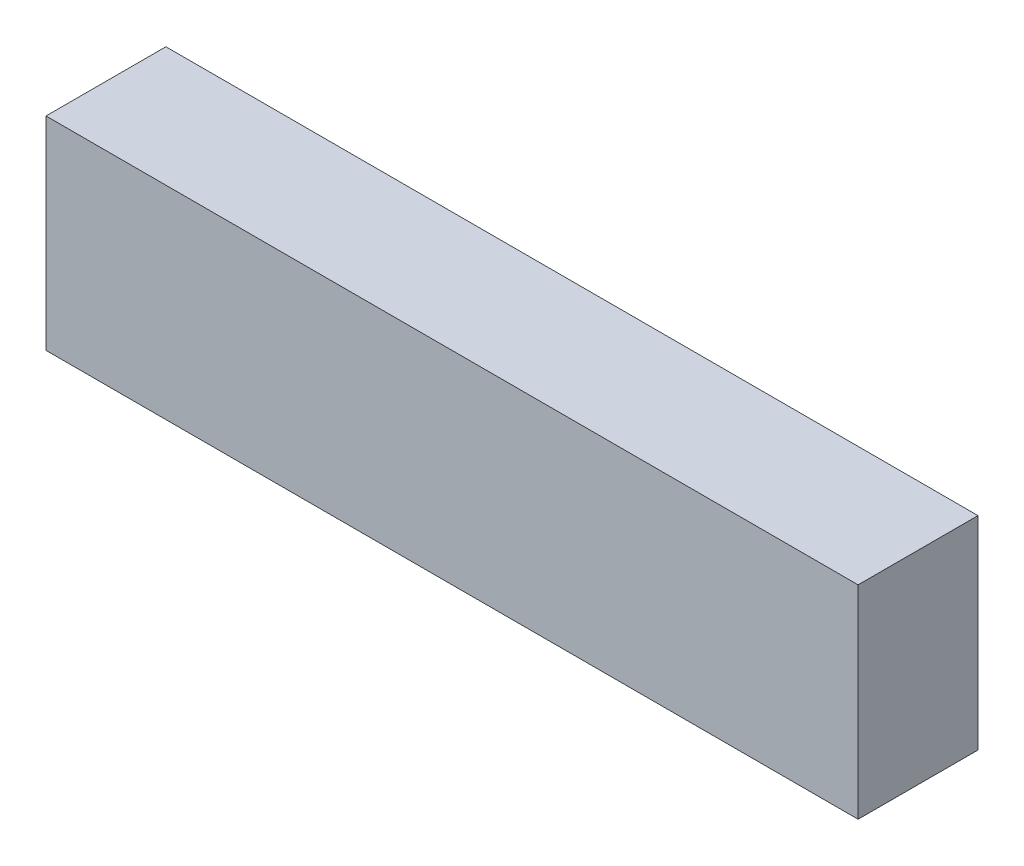
ISO-10303-21;
HEADER;
FILE_DESCRIPTION(('STEP AP214'),'2;1');
FILE_NAME('part.step','',(''),(''),'','','');
FILE_SCHEMA(('AUTOMOTIVE_DESIGN { 1 0 10303 214 1 1 1 1 }'));
ENDSEC;
DATA;
#1=APPLICATION_CONTEXT('core data for automotive mechanical design processes');
#2=APPLICATION_PROTOCOL_DEFINITION('international standard','automotive_design',2000,#1);
#3=PRODUCT_CONTEXT('',#1,'mechanical');
#4=PRODUCT('Part','Part','',(#3));
#5=PRODUCT_RELATED_PRODUCT_CATEGORY('part','',(#4));
#6=PRODUCT_DEFINITION_FORMATION('','',#4);
#7=PRODUCT_DEFINITION_CONTEXT('part definition',#1,'design');
#8=PRODUCT_DEFINITION('design','',#6,#7);
#9=PRODUCT_DEFINITION_SHAPE('','',#8);
#10=(LENGTH_UNIT() NAMED_UNIT(*) SI_UNIT(.MILLI.,.METRE.));
#11=(NAMED_UNIT(*) PLANE_ANGLE_UNIT() SI_UNIT($,.RADIAN.));
#12=(NAMED_UNIT(*) SI_UNIT($,.STERADIAN.) SOLID_ANGLE_UNIT());
#13=UNCERTAINTY_MEASURE_WITH_UNIT(LENGTH_MEASURE(1.E-05),#10,'distance_accuracy_value','');
#14=(GEOMETRIC_REPRESENTATION_CONTEXT(3) GLOBAL_UNCERTAINTY_ASSIGNED_CONTEXT((#13)) GLOBAL_UNIT_ASSIGNED_CONTEXT((#10,
#11,#12)) REPRESENTATION_CONTEXT('',''));
#15=CARTESIAN_POINT('',(0.,0.,0.));
#16=DIRECTION('',(0.,0.,1.));
#17=DIRECTION('',(1.,0.,0.));
#18=AXIS2_PLACEMENT_3D('',#15,#16,#17);
#19=CARTESIAN_POINT('',(19.05,3.81,5.));
#20=DIRECTION('',(0.,0.,-1.));
#21=DIRECTION('',(-1.,0.,0.));
#22=AXIS2_PLACEMENT_3D('',#19,#20,#21);
#23=PLANE('',#22);
#24=DIRECTION('',(0.,1.,0.));
#25=VECTOR('',#24,1.);
#26=CARTESIAN_POINT('',(-1.27,3.81,5.));
#27=LINE('',#26,#25);
#28=CARTESIAN_POINT('',(-1.27,3.81,5.));
#29=VERTEX_POINT('',#28);
#30=CARTESIAN_POINT('',(-1.27,-1.27,5.));
#31=VERTEX_POINT('',#30);
#32=EDGE_CURVE('E55',#29,#31,#27,.F.);
#33=ORIENTED_EDGE('',*,*,#32,.T.);
#34=DIRECTION('',(1.,0.,0.));
#35=VECTOR('',#34,1.);
#36=CARTESIAN_POINT('',(-1.27,-1.27,5.));
#37=LINE('',#36,#35);
#38=CARTESIAN_POINT('',(19.05,-1.27,5.));
#39=VERTEX_POINT('',#38);
#40=EDGE_CURVE('E57',#31,#39,#37,.T.);
#41=ORIENTED_EDGE('',*,*,#40,.T.);
#42=DIRECTION('',(0.,1.,0.));
#43=VECTOR('',#42,1.);
#44=CARTESIAN_POINT('',(19.05,-1.27,5.));
#45=LINE('',#44,#43);
#46=CARTESIAN_POINT('',(19.05,3.81,5.));
#47=VERTEX_POINT('',#46);
#48=EDGE_CURVE('E20',#39,#47,#45,.T.);
#49=ORIENTED_EDGE('',*,*,#48,.T.);
#50=DIRECTION('',(1.,0.,0.));
#51=VECTOR('',#50,1.);
#52=CARTESIAN_POINT('',(19.05,3.81,5.));
#53=LINE('',#52,#51);
#54=EDGE_CURVE('E80',#47,#29,#53,.F.);
#55=ORIENTED_EDGE('',*,*,#54,.T.);
#56=EDGE_LOOP('',(#33,#41,#49,#55));
#57=FACE_BOUND('',#56,.T.);
#58=ADVANCED_FACE('F17',(#57),#23,.F.);
#59=CARTESIAN_POINT('',(19.05,-1.27,2.));
#60=DIRECTION('',(-1.,0.,0.));
#61=DIRECTION('',(0.,0.,1.));
#62=AXIS2_PLACEMENT_3D('',#59,#60,#61);
#63=PLANE('',#62);
#64=DIRECTION('',(0.,0.,-1.));
#65=VECTOR('',#64,1.);
#66=CARTESIAN_POINT('',(19.05,3.81,2.));
#67=LINE('',#66,#65);
#68=CARTESIAN_POINT('',(19.05,3.81,2.));
#69=VERTEX_POINT('',#68);
#70=EDGE_CURVE('E68',#69,#47,#67,.F.);
#71=ORIENTED_EDGE('',*,*,#70,.T.);
#72=ORIENTED_EDGE('',*,*,#48,.F.);
#73=DIRECTION('',(0.,0.,1.));
#74=VECTOR('',#73,1.);
#75=CARTESIAN_POINT('',(19.05,-1.27,2.));
#76=LINE('',#75,#74);
#77=CARTESIAN_POINT('',(19.05,-1.27,2.));
#78=VERTEX_POINT('',#77);
#79=EDGE_CURVE('E63',#39,#78,#76,.F.);
#80=ORIENTED_EDGE('',*,*,#79,.T.);
#81=DIRECTION('',(0.,1.,0.));
#82=VECTOR('',#81,1.);
#83=CARTESIAN_POINT('',(19.05,3.81,2.));
#84=LINE('',#83,#82);
#85=EDGE_CURVE('E83',#69,#78,#84,.F.);
#86=ORIENTED_EDGE('',*,*,#85,.F.);
#87=EDGE_LOOP('',(#71,#72,#80,#86));
#88=FACE_BOUND('',#87,.T.);
#89=ADVANCED_FACE('F65',(#88),#63,.F.);
#90=CARTESIAN_POINT('',(-1.27,-1.27,2.));
#91=DIRECTION('',(0.,1.,0.));
#92=DIRECTION('',(0.,0.,1.));
#93=AXIS2_PLACEMENT_3D('',#90,#91,#92);
#94=PLANE('',#93);
#95=ORIENTED_EDGE('',*,*,#79,.F.);
#96=ORIENTED_EDGE('',*,*,#40,.F.);
#97=DIRECTION('',(0.,0.,-1.));
#98=VECTOR('',#97,1.);
#99=CARTESIAN_POINT('',(-1.27,-1.27,2.));
#100=LINE('',#99,#98);
#101=CARTESIAN_POINT('',(-1.27,-1.27,2.));
#102=VERTEX_POINT('',#101);
#103=EDGE_CURVE('E75',#31,#102,#100,.T.);
#104=ORIENTED_EDGE('',*,*,#103,.T.);
#105=DIRECTION('',(-1.,0.,0.));
#106=VECTOR('',#105,1.);
#107=CARTESIAN_POINT('',(19.05,-1.27,2.));
#108=LINE('',#107,#106);
#109=EDGE_CURVE('E72',#78,#102,#108,.T.);
#110=ORIENTED_EDGE('',*,*,#109,.F.);
#111=EDGE_LOOP('',(#95,#96,#104,#110));
#112=FACE_BOUND('',#111,.T.);
#113=ADVANCED_FACE('F70',(#112),#94,.F.);
#114=CARTESIAN_POINT('',(-1.27,3.81,2.));
#115=DIRECTION('',(1.,0.,0.));
#116=DIRECTION('',(0.,0.,-1.));
#117=AXIS2_PLACEMENT_3D('',#114,#115,#116);
#118=PLANE('',#117);
#119=ORIENTED_EDGE('',*,*,#103,.F.);
#120=ORIENTED_EDGE('',*,*,#32,.F.);
#121=DIRECTION('',(0.,0.,-1.));
#122=VECTOR('',#121,1.);
#123=CARTESIAN_POINT('',(-1.27,3.81,2.));
#124=LINE('',#123,#122);
#125=CARTESIAN_POINT('',(-1.27,3.81,2.));
#126=VERTEX_POINT('',#125);
#127=EDGE_CURVE('E35',#29,#126,#124,.T.);
#128=ORIENTED_EDGE('',*,*,#127,.T.);
#129=DIRECTION('',(0.,1.,0.));
#130=VECTOR('',#129,1.);
#131=CARTESIAN_POINT('',(-1.27,3.81,2.));
#132=LINE('',#131,#130);
#133=EDGE_CURVE('E26',#102,#126,#132,.T.);
#134=ORIENTED_EDGE('',*,*,#133,.F.);
#135=EDGE_LOOP('',(#119,#120,#128,#134));
#136=FACE_BOUND('',#135,.T.);
#137=ADVANCED_FACE('F89',(#136),#118,.F.);
#138=CARTESIAN_POINT('',(19.05,3.81,2.));
#139=DIRECTION('',(0.,-1.,0.));
#140=DIRECTION('',(0.,0.,-1.));
#141=AXIS2_PLACEMENT_3D('',#138,#139,#140);
#142=PLANE('',#141);
#143=ORIENTED_EDGE('',*,*,#127,.F.);
#144=ORIENTED_EDGE('',*,*,#54,.F.);
#145=ORIENTED_EDGE('',*,*,#70,.F.);
#146=DIRECTION('',(-1.,0.,0.));
#147=VECTOR('',#146,1.);
#148=CARTESIAN_POINT('',(19.05,3.81,2.));
#149=LINE('',#148,#147);
#150=EDGE_CURVE('E11',#126,#69,#149,.F.);
#151=ORIENTED_EDGE('',*,*,#150,.F.);
#152=EDGE_LOOP('',(#143,#144,#145,#151));
#153=FACE_BOUND('',#152,.T.);
#154=ADVANCED_FACE('F91',(#153),#142,.F.);
#155=CARTESIAN_POINT('',(19.05,3.81,2.));
#156=DIRECTION('',(0.,0.,-1.));
#157=DIRECTION('',(-1.,0.,0.));
#158=AXIS2_PLACEMENT_3D('',#155,#156,#157);
#159=PLANE('',#158);
#160=ORIENTED_EDGE('',*,*,#133,.T.);
#161=ORIENTED_EDGE('',*,*,#150,.T.);
#162=ORIENTED_EDGE('',*,*,#85,.T.);
#163=ORIENTED_EDGE('',*,*,#109,.T.);
#164=EDGE_LOOP('',(#160,#161,#162,#163));
#165=FACE_BOUND('',#164,.T.);
#166=ADVANCED_FACE('F88',(#165),#159,.T.);
#167=CLOSED_SHELL('',(#58,#89,#113,#137,#154,#166));
#168=MANIFOLD_SOLID_BREP('B1',#167);
#169=ADVANCED_BREP_SHAPE_REPRESENTATION('',(#18,#168),#14);
#170=SHAPE_DEFINITION_REPRESENTATION(#9,#169);
ENDSEC;
END-ISO-10303-21;
